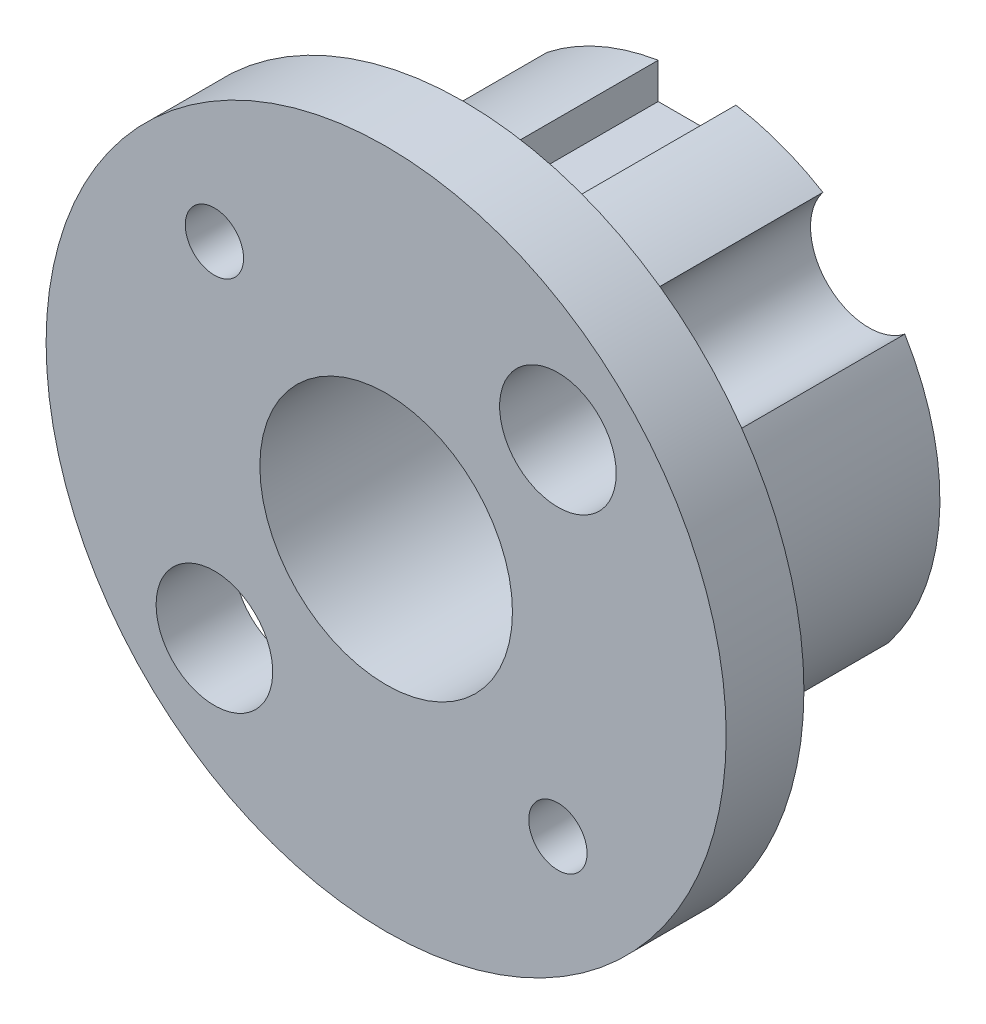
ISO-10303-21;
HEADER;
FILE_DESCRIPTION(('STEP AP214'),'2;1');
FILE_NAME('part.step','',(''),(''),'','','');
FILE_SCHEMA(('AUTOMOTIVE_DESIGN { 1 0 10303 214 1 1 1 1 }'));
ENDSEC;
DATA;
#1=APPLICATION_CONTEXT('core data for automotive mechanical design processes');
#2=APPLICATION_PROTOCOL_DEFINITION('international standard','automotive_design',2000,#1);
#3=PRODUCT_CONTEXT('',#1,'mechanical');
#4=PRODUCT('Part','Part','',(#3));
#5=PRODUCT_RELATED_PRODUCT_CATEGORY('part','',(#4));
#6=PRODUCT_DEFINITION_FORMATION('','',#4);
#7=PRODUCT_DEFINITION_CONTEXT('part definition',#1,'design');
#8=PRODUCT_DEFINITION('design','',#6,#7);
#9=PRODUCT_DEFINITION_SHAPE('','',#8);
#10=(LENGTH_UNIT() NAMED_UNIT(*) SI_UNIT(.MILLI.,.METRE.));
#11=(NAMED_UNIT(*) PLANE_ANGLE_UNIT() SI_UNIT($,.RADIAN.));
#12=(NAMED_UNIT(*) SI_UNIT($,.STERADIAN.) SOLID_ANGLE_UNIT());
#13=UNCERTAINTY_MEASURE_WITH_UNIT(LENGTH_MEASURE(1.E-05),#10,'distance_accuracy_value','');
#14=(GEOMETRIC_REPRESENTATION_CONTEXT(3) GLOBAL_UNCERTAINTY_ASSIGNED_CONTEXT((#13)) GLOBAL_UNIT_ASSIGNED_CONTEXT((#10,
#11,#12)) REPRESENTATION_CONTEXT('',''));
#15=CARTESIAN_POINT('',(0.,0.,0.));
#16=DIRECTION('',(0.,0.,1.));
#17=DIRECTION('',(1.,0.,0.));
#18=AXIS2_PLACEMENT_3D('',#15,#16,#17);
#19=CARTESIAN_POINT('',(0.,0.,12.));
#20=DIRECTION('',(0.,0.,-1.));
#21=DIRECTION('',(-1.,0.,0.));
#22=AXIS2_PLACEMENT_3D('',#19,#20,#21);
#23=CYLINDRICAL_SURFACE('',#22,12.5);
#24=CARTESIAN_POINT('',(0.,0.,0.));
#25=DIRECTION('',(0.,0.,1.));
#26=DIRECTION('',(1.,0.,0.));
#27=AXIS2_PLACEMENT_3D('',#24,#25,#26);
#28=CIRCLE('',#27,12.5);
#29=CARTESIAN_POINT('',(1.99999999999999,-12.3389626792531,0.));
#30=VERTEX_POINT('',#29);
#31=CARTESIAN_POINT('',(7.71644589242379,-9.83394441662632,0.));
#32=VERTEX_POINT('',#31);
#33=EDGE_CURVE('E219',#30,#32,#28,.T.);
#34=ORIENTED_EDGE('',*,*,#33,.T.);
#35=DIRECTION('',(0.,0.,1.));
#36=VECTOR('',#35,1.);
#37=CARTESIAN_POINT('',(7.71644589242379,-9.83394441662632,8.));
#38=LINE('',#37,#36);
#39=CARTESIAN_POINT('',(7.71644589242379,-9.83394441662632,12.));
#40=VERTEX_POINT('',#39);
#41=EDGE_CURVE('E200',#32,#40,#38,.T.);
#42=ORIENTED_EDGE('',*,*,#41,.T.);
#43=CARTESIAN_POINT('',(0.,0.,12.));
#44=DIRECTION('',(0.,0.,1.));
#45=DIRECTION('',(1.,0.,0.));
#46=AXIS2_PLACEMENT_3D('',#43,#44,#45);
#47=CIRCLE('',#46,12.5);
#48=CARTESIAN_POINT('',(0.,-12.5,12.));
#49=VERTEX_POINT('',#48);
#50=EDGE_CURVE('E274',#49,#40,#47,.T.);
#51=ORIENTED_EDGE('',*,*,#50,.F.);
#52=CARTESIAN_POINT('',(0.,-12.5,12.));
#53=CARTESIAN_POINT('',(0.0558905429577532,-12.5000020835964,12.000000042498));
#54=CARTESIAN_POINT('',(0.111753971249328,-12.4996246798577,11.997655704353));
#55=CARTESIAN_POINT('',(0.223074214217851,-12.4981330213372,11.9883059218664));
#56=CARTESIAN_POINT('',(0.278531066577653,-12.4970188357387,11.9813009151575));
#57=CARTESIAN_POINT('',(0.443540911461011,-12.4926105383146,11.9533760060253));
#58=CARTESIAN_POINT('',(0.551977808939556,-12.4882504972334,11.9255459342959));
#59=CARTESIAN_POINT('',(0.762565788228954,-12.4771650841322,11.8522808407173));
#60=CARTESIAN_POINT('',(0.864715194600273,-12.4704390848295,11.8068411497334));
#61=CARTESIAN_POINT('',(1.0599576302829,-12.4553635017494,11.6996720068355));
#62=CARTESIAN_POINT('',(1.15305052325027,-12.4470138935346,11.6379423097307));
#63=CARTESIAN_POINT('',(1.32832296447629,-12.429537039633,11.4993792247033));
#64=CARTESIAN_POINT('',(1.41041206904756,-12.420404254393,11.4224321773373));
#65=CARTESIAN_POINT('',(1.56058463585782,-12.402431574554,11.2558468557373));
#66=CARTESIAN_POINT('',(1.62866536080302,-12.3935917374809,11.166206106869));
#67=CARTESIAN_POINT('',(1.74924960717359,-12.3771508989721,10.97615029407));
#68=CARTESIAN_POINT('',(1.80165914935875,-12.3695574900993,10.8756749577867));
#69=CARTESIAN_POINT('',(1.88879493681568,-12.3565531749584,10.6672277160488));
#70=CARTESIAN_POINT('',(1.92353292532613,-12.351140819818,10.5592608432878));
#71=CARTESIAN_POINT('',(1.96587791181031,-12.3444570626391,10.3755525901847));
#72=CARTESIAN_POINT('',(1.97866122475133,-12.3424077338064,10.3009915247811));
#73=CARTESIAN_POINT('',(1.9957236597849,-12.3396558937214,10.1509650813836));
#74=CARTESIAN_POINT('',(2.00001247582687,-12.3389518472605,10.0755008332068));
#75=CARTESIAN_POINT('',(1.99999999999999,-12.3389626792531,10.));
#76=B_SPLINE_CURVE_WITH_KNOTS('',3,(#52,#53,#54,#55,#56,#57,#58,#59,#60,#61,#62,#63,#64,#65,#66,
#67,#68,#69,#70,#71,#72,#73,#74,#75),.UNSPECIFIED.,.F.,.F.,(4,2,2,2,2,2,2,2,2,2,2,4),(0.,
0.167567545990328,0.335119359759175,0.669498567970095,1.00396649649472,1.33843945958565,
1.67551200041385,2.01265034415503,2.35177170840806,2.6906674217365,2.91723347514518,
3.14354082126525),.UNSPECIFIED.);
#77=CARTESIAN_POINT('',(1.99999999999999,-12.3389626792531,10.));
#78=VERTEX_POINT('',#77);
#79=EDGE_CURVE('E437',#49,#78,#76,.T.);
#80=ORIENTED_EDGE('',*,*,#79,.T.);
#81=DIRECTION('',(0.,0.,-1.));
#82=VECTOR('',#81,1.);
#83=CARTESIAN_POINT('',(1.99999999999999,-12.3389626792531,12.));
#84=LINE('',#83,#82);
#85=EDGE_CURVE('E226',#78,#30,#84,.T.);
#86=ORIENTED_EDGE('',*,*,#85,.T.);
#87=EDGE_LOOP('',(#34,#42,#51,#80,#86));
#88=FACE_BOUND('',#87,.T.);
#89=ADVANCED_FACE('F38',(#88),#23,.T.);
#90=CARTESIAN_POINT('',(-9.83394441662635,7.71644589242376,0.));
#91=VERTEX_POINT('',#90);
#92=CARTESIAN_POINT('',(-10.6902677765788,-6.4782848706306,0.));
#93=VERTEX_POINT('',#92);
#94=EDGE_CURVE('E245',#91,#93,#28,.T.);
#95=ORIENTED_EDGE('',*,*,#94,.T.);
#96=DIRECTION('',(0.,0.,1.));
#97=VECTOR('',#96,1.);
#98=CARTESIAN_POINT('',(-10.6902677765788,-6.4782848706306,8.));
#99=LINE('',#98,#97);
#100=CARTESIAN_POINT('',(-10.6902677765788,-6.4782848706306,12.));
#101=VERTEX_POINT('',#100);
#102=EDGE_CURVE('E302',#93,#101,#99,.T.);
#103=ORIENTED_EDGE('',*,*,#102,.T.);
#104=CARTESIAN_POINT('',(-9.83394441662635,7.71644589242376,12.));
#105=VERTEX_POINT('',#104);
#106=EDGE_CURVE('E236',#105,#101,#47,.T.);
#107=ORIENTED_EDGE('',*,*,#106,.F.);
#108=DIRECTION('',(0.,0.,1.));
#109=VECTOR('',#108,1.);
#110=CARTESIAN_POINT('',(-9.83394441662635,7.71644589242376,8.));
#111=LINE('',#110,#109);
#112=EDGE_CURVE('E301',#105,#91,#111,.F.);
#113=ORIENTED_EDGE('',*,*,#112,.T.);
#114=EDGE_LOOP('',(#95,#103,#107,#113));
#115=FACE_BOUND('',#114,.T.);
#116=ADVANCED_FACE('F300',(#115),#23,.T.);
#117=CARTESIAN_POINT('',(-2.,12.3389626792531,0.));
#118=VERTEX_POINT('',#117);
#119=CARTESIAN_POINT('',(-7.7164458924238,9.83394441662632,0.));
#120=VERTEX_POINT('',#119);
#121=EDGE_CURVE('E231',#118,#120,#28,.T.);
#122=ORIENTED_EDGE('',*,*,#121,.T.);
#123=DIRECTION('',(0.,0.,1.));
#124=VECTOR('',#123,1.);
#125=CARTESIAN_POINT('',(-7.7164458924238,9.83394441662632,8.));
#126=LINE('',#125,#124);
#127=CARTESIAN_POINT('',(-7.7164458924238,9.83394441662632,12.));
#128=VERTEX_POINT('',#127);
#129=EDGE_CURVE('E323',#120,#128,#126,.T.);
#130=ORIENTED_EDGE('',*,*,#129,.T.);
#131=CARTESIAN_POINT('',(0.,12.5,12.));
#132=VERTEX_POINT('',#131);
#133=EDGE_CURVE('E277',#132,#128,#47,.T.);
#134=ORIENTED_EDGE('',*,*,#133,.F.);
#135=CARTESIAN_POINT('',(0.,12.5,12.));
#136=CARTESIAN_POINT('',(-0.0558905429577552,12.5000020835964,12.000000042498));
#137=CARTESIAN_POINT('',(-0.11175397124933,12.4996246798577,11.997655704353));
#138=CARTESIAN_POINT('',(-0.223074214217853,12.4981330213372,11.9883059218664));
#139=CARTESIAN_POINT('',(-0.278531066577655,12.4970188357387,11.9813009151575));
#140=CARTESIAN_POINT('',(-0.443540911461013,12.4926105383146,11.9533760060253));
#141=CARTESIAN_POINT('',(-0.551977808939557,12.4882504972334,11.9255459342959));
#142=CARTESIAN_POINT('',(-0.762565788228955,12.4771650841322,11.8522808407173));
#143=CARTESIAN_POINT('',(-0.864715194600275,12.4704390848295,11.8068411497334));
#144=CARTESIAN_POINT('',(-1.0599576302829,12.4553635017494,11.6996720068355));
#145=CARTESIAN_POINT('',(-1.15305052325027,12.4470138935346,11.6379423097307));
#146=CARTESIAN_POINT('',(-1.32832296447629,12.429537039633,11.4993792247033));
#147=CARTESIAN_POINT('',(-1.41041206904756,12.420404254393,11.4224321773373));
#148=CARTESIAN_POINT('',(-1.56058463585782,12.402431574554,11.2558468557373));
#149=CARTESIAN_POINT('',(-1.62866536080302,12.3935917374809,11.166206106869));
#150=CARTESIAN_POINT('',(-1.74924960717359,12.3771508989721,10.97615029407));
#151=CARTESIAN_POINT('',(-1.80165914935875,12.3695574900993,10.8756749577867));
#152=CARTESIAN_POINT('',(-1.88879493681568,12.3565531749584,10.6672277160488));
#153=CARTESIAN_POINT('',(-1.92353292532613,12.351140819818,10.5592608432878));
#154=CARTESIAN_POINT('',(-1.96587791181031,12.3444570626391,10.3755525901847));
#155=CARTESIAN_POINT('',(-1.97866122475133,12.3424077338064,10.3009915247811));
#156=CARTESIAN_POINT('',(-1.9957236597849,12.3396558937214,10.1509650813836));
#157=CARTESIAN_POINT('',(-2.00001247582687,12.3389518472605,10.0755008332068));
#158=CARTESIAN_POINT('',(-2.,12.3389626792531,10.));
#159=B_SPLINE_CURVE_WITH_KNOTS('',3,(#135,#136,#137,#138,#139,#140,#141,#142,#143,#144,#145,
#146,#147,#148,#149,#150,#151,#152,#153,#154,#155,#156,#157,#158),.UNSPECIFIED.,.F.,.F.,(4,2,2,
2,2,2,2,2,2,2,2,4),(0.,0.167567545990328,0.335119359759174,0.669498567970095,1.00396649649472,
1.33843945958565,1.67551200041385,2.01265034415503,2.35177170840805,2.6906674217365,
2.91723347514518,3.14354082126525),.UNSPECIFIED.);
#160=CARTESIAN_POINT('',(-2.,12.3389626792531,10.));
#161=VERTEX_POINT('',#160);
#162=EDGE_CURVE('E11',#132,#161,#159,.T.);
#163=ORIENTED_EDGE('',*,*,#162,.T.);
#164=DIRECTION('',(0.,0.,-1.));
#165=VECTOR('',#164,1.);
#166=CARTESIAN_POINT('',(-2.,12.3389626792531,12.));
#167=LINE('',#166,#165);
#168=EDGE_CURVE('E373',#161,#118,#167,.T.);
#169=ORIENTED_EDGE('',*,*,#168,.T.);
#170=EDGE_LOOP('',(#122,#130,#134,#163,#169));
#171=FACE_BOUND('',#170,.T.);
#172=ADVANCED_FACE('F485',(#171),#23,.T.);
#173=CARTESIAN_POINT('',(9.83394441662635,-7.71644589242376,12.));
#174=VERTEX_POINT('',#173);
#175=CARTESIAN_POINT('',(10.6902677765788,6.4782848706306,12.));
#176=VERTEX_POINT('',#175);
#177=EDGE_CURVE('E238',#174,#176,#47,.T.);
#178=ORIENTED_EDGE('',*,*,#177,.F.);
#179=DIRECTION('',(0.,0.,1.));
#180=VECTOR('',#179,1.);
#181=CARTESIAN_POINT('',(9.83394441662635,-7.71644589242376,8.));
#182=LINE('',#181,#180);
#183=CARTESIAN_POINT('',(9.83394441662635,-7.71644589242376,0.));
#184=VERTEX_POINT('',#183);
#185=EDGE_CURVE('E212',#174,#184,#182,.F.);
#186=ORIENTED_EDGE('',*,*,#185,.T.);
#187=CARTESIAN_POINT('',(10.6902677765788,6.4782848706306,0.));
#188=VERTEX_POINT('',#187);
#189=EDGE_CURVE('E221',#184,#188,#28,.T.);
#190=ORIENTED_EDGE('',*,*,#189,.T.);
#191=DIRECTION('',(0.,0.,1.));
#192=VECTOR('',#191,1.);
#193=CARTESIAN_POINT('',(10.6902677765788,6.4782848706306,8.));
#194=LINE('',#193,#192);
#195=EDGE_CURVE('E340',#188,#176,#194,.T.);
#196=ORIENTED_EDGE('',*,*,#195,.T.);
#197=EDGE_LOOP('',(#178,#186,#190,#196));
#198=FACE_BOUND('',#197,.T.);
#199=ADVANCED_FACE('F498',(#198),#23,.T.);
#200=CARTESIAN_POINT('',(-6.47828487063055,-10.6902677765788,12.));
#201=VERTEX_POINT('',#200);
#202=EDGE_CURVE('E229',#201,#49,#47,.T.);
#203=ORIENTED_EDGE('',*,*,#202,.F.);
#204=DIRECTION('',(0.,0.,1.));
#205=VECTOR('',#204,1.);
#206=CARTESIAN_POINT('',(-6.47828487063056,-10.6902677765788,8.));
#207=LINE('',#206,#205);
#208=CARTESIAN_POINT('',(-6.47828487063056,-10.6902677765788,0.));
#209=VERTEX_POINT('',#208);
#210=EDGE_CURVE('E306',#201,#209,#207,.F.);
#211=ORIENTED_EDGE('',*,*,#210,.T.);
#212=CARTESIAN_POINT('',(-1.99999999999999,-12.3389626792531,0.));
#213=VERTEX_POINT('',#212);
#214=EDGE_CURVE('E241',#209,#213,#28,.T.);
#215=ORIENTED_EDGE('',*,*,#214,.T.);
#216=DIRECTION('',(0.,0.,-1.));
#217=VECTOR('',#216,1.);
#218=CARTESIAN_POINT('',(-1.99999999999999,-12.3389626792531,12.));
#219=LINE('',#218,#217);
#220=CARTESIAN_POINT('',(-1.99999999999999,-12.3389626792531,10.));
#221=VERTEX_POINT('',#220);
#222=EDGE_CURVE('E259',#213,#221,#219,.F.);
#223=ORIENTED_EDGE('',*,*,#222,.T.);
#224=CARTESIAN_POINT('',(-1.99999999999999,-12.3389626792531,10.));
#225=CARTESIAN_POINT('',(-2.00000005506645,-12.3389604493862,10.0558858991006));
#226=CARTESIAN_POINT('',(-1.9976560947646,-12.3393428423211,10.1117446684925));
#227=CARTESIAN_POINT('',(-1.98830789892238,-12.3408534909263,10.2230553322535));
#228=CARTESIAN_POINT('',(-1.98130411089571,-12.3419816749734,10.2785072651767));
#229=CARTESIAN_POINT('',(-1.95338448111261,-12.3464434827045,10.4435006134786));
#230=CARTESIAN_POINT('',(-1.92556009070672,-12.3508545621137,10.5519255958508));
#231=CARTESIAN_POINT('',(-1.85231153724332,-12.3620506890651,10.7624890925939));
#232=CARTESIAN_POINT('',(-1.80688287534576,-12.3688363433962,10.8646259922825));
#233=CARTESIAN_POINT('',(-1.69973950153268,-12.3840139875357,11.0598478333941));
#234=CARTESIAN_POINT('',(-1.63802444361295,-12.3924060114704,11.1529325824468));
#235=CARTESIAN_POINT('',(-1.4994761629108,-12.4099344029248,11.3282144877859));
#236=CARTESIAN_POINT('',(-1.42252599199839,-12.4190761860561,11.4103186274438));
#237=CARTESIAN_POINT('',(-1.25592824724286,-12.4370273478356,11.5605201241274));
#238=CARTESIAN_POINT('',(-1.16627826390237,-12.4458366630031,11.6286148171568));
#239=CARTESIAN_POINT('',(-0.976214272244022,-12.4621886686874,11.7492138030634));
#240=CARTESIAN_POINT('',(-0.875741602257079,-12.4697238224233,11.8016266494663));
#241=CARTESIAN_POINT('',(-0.667299791484408,-12.4826112053308,11.8887694376935));
#242=CARTESIAN_POINT('',(-0.559335638633808,-12.4879648709531,11.9235110193196));
#243=CARTESIAN_POINT('',(-0.375617480288589,-12.4945727415485,11.9658660760765));
#244=CARTESIAN_POINT('',(-0.301042959463293,-12.4965974895009,11.9786539297587));
#245=CARTESIAN_POINT('',(-0.150990358801892,-12.4993154914097,11.9957222305326));
#246=CARTESIAN_POINT('',(-0.0755134178412784,-12.5000102753353,12.0000124533597));
#247=CARTESIAN_POINT('',(0.,-12.5,12.));
#248=B_SPLINE_CURVE_WITH_KNOTS('',3,(#224,#225,#226,#227,#228,#229,#230,#231,#232,#233,#234,
#235,#236,#237,#238,#239,#240,#241,#242,#243,#244,#245,#246,#247),.UNSPECIFIED.,.F.,.F.,(4,2,2,
2,2,2,2,2,2,2,2,4),(0.,0.167553572692233,0.335091056442252,0.669437461377178,1.00386936624387,
1.33830837668286,1.6754217767851,2.01259922227806,2.35170617625324,2.69058947527825,
2.91719561434318,3.14354091231936),.UNSPECIFIED.);
#249=EDGE_CURVE('E429',#221,#49,#248,.T.);
#250=ORIENTED_EDGE('',*,*,#249,.T.);
#251=EDGE_LOOP('',(#203,#211,#215,#223,#250));
#252=FACE_BOUND('',#251,.T.);
#253=ADVANCED_FACE('F508',(#252),#23,.T.);
#254=CARTESIAN_POINT('',(6.47828487063056,10.6902677765788,12.));
#255=VERTEX_POINT('',#254);
#256=EDGE_CURVE('E281',#255,#132,#47,.T.);
#257=ORIENTED_EDGE('',*,*,#256,.F.);
#258=DIRECTION('',(0.,0.,1.));
#259=VECTOR('',#258,1.);
#260=CARTESIAN_POINT('',(6.47828487063056,10.6902677765788,8.));
#261=LINE('',#260,#259);
#262=CARTESIAN_POINT('',(6.47828487063056,10.6902677765788,0.));
#263=VERTEX_POINT('',#262);
#264=EDGE_CURVE('E336',#255,#263,#261,.F.);
#265=ORIENTED_EDGE('',*,*,#264,.T.);
#266=CARTESIAN_POINT('',(2.,12.3389626792531,0.));
#267=VERTEX_POINT('',#266);
#268=EDGE_CURVE('E240',#263,#267,#28,.T.);
#269=ORIENTED_EDGE('',*,*,#268,.T.);
#270=DIRECTION('',(0.,0.,-1.));
#271=VECTOR('',#270,1.);
#272=CARTESIAN_POINT('',(2.,12.3389626792531,12.));
#273=LINE('',#272,#271);
#274=CARTESIAN_POINT('',(2.,12.3389626792531,10.));
#275=VERTEX_POINT('',#274);
#276=EDGE_CURVE('E368',#267,#275,#273,.F.);
#277=ORIENTED_EDGE('',*,*,#276,.T.);
#278=CARTESIAN_POINT('',(2.,12.3389626792531,10.));
#279=CARTESIAN_POINT('',(2.00000005506646,12.3389604493862,10.0558858991006));
#280=CARTESIAN_POINT('',(1.99765609476461,12.3393428423211,10.1117446684925));
#281=CARTESIAN_POINT('',(1.98830789892238,12.3408534909263,10.2230553322535));
#282=CARTESIAN_POINT('',(1.98130411089571,12.3419816749734,10.2785072651767));
#283=CARTESIAN_POINT('',(1.95338448111261,12.3464434827045,10.4435006134786));
#284=CARTESIAN_POINT('',(1.92556009070672,12.3508545621137,10.5519255958508));
#285=CARTESIAN_POINT('',(1.85231153724333,12.3620506890651,10.7624890925939));
#286=CARTESIAN_POINT('',(1.80688287534576,12.3688363433962,10.8646259922825));
#287=CARTESIAN_POINT('',(1.69973950153268,12.3840139875357,11.0598478333941));
#288=CARTESIAN_POINT('',(1.63802444361296,12.3924060114704,11.1529325824468));
#289=CARTESIAN_POINT('',(1.4994761629108,12.4099344029248,11.3282144877859));
#290=CARTESIAN_POINT('',(1.4225259919984,12.4190761860561,11.4103186274438));
#291=CARTESIAN_POINT('',(1.25592824724286,12.4370273478356,11.5605201241274));
#292=CARTESIAN_POINT('',(1.16627826390238,12.4458366630031,11.6286148171568));
#293=CARTESIAN_POINT('',(0.976214272244024,12.4621886686874,11.7492138030634));
#294=CARTESIAN_POINT('',(0.875741602257082,12.4697238224233,11.8016266494663));
#295=CARTESIAN_POINT('',(0.667299791484412,12.4826112053308,11.8887694376935));
#296=CARTESIAN_POINT('',(0.559335638633812,12.4879648709531,11.9235110193196));
#297=CARTESIAN_POINT('',(0.375617480288593,12.4945727415485,11.9658660760765));
#298=CARTESIAN_POINT('',(0.301042959463297,12.4965974895009,11.9786539297587));
#299=CARTESIAN_POINT('',(0.150990358801896,12.4993154914097,11.9957222305326));
#300=CARTESIAN_POINT('',(0.0755134178412821,12.5000102753353,12.0000124533597));
#301=CARTESIAN_POINT('',(0.,12.5,12.));
#302=B_SPLINE_CURVE_WITH_KNOTS('',3,(#278,#279,#280,#281,#282,#283,#284,#285,#286,#287,#288,
#289,#290,#291,#292,#293,#294,#295,#296,#297,#298,#299,#300,#301),.UNSPECIFIED.,.F.,.F.,(4,2,2,
2,2,2,2,2,2,2,2,4),(0.,0.167553572692233,0.335091056442252,0.669437461377178,1.00386936624387,
1.33830837668286,1.6754217767851,2.01259922227806,2.35170617625324,2.69058947527825,
2.91719561434318,3.14354091231936),.UNSPECIFIED.);
#303=EDGE_CURVE('E49',#275,#132,#302,.T.);
#304=ORIENTED_EDGE('',*,*,#303,.T.);
#305=EDGE_LOOP('',(#257,#265,#269,#277,#304));
#306=FACE_BOUND('',#305,.T.);
#307=ADVANCED_FACE('F443',(#306),#23,.T.);
#308=CARTESIAN_POINT('',(0.,0.,0.));
#309=DIRECTION('',(0.,0.,1.));
#310=DIRECTION('',(1.,0.,0.));
#311=AXIS2_PLACEMENT_3D('',#308,#309,#310);
#312=PLANE('',#311);
#313=CARTESIAN_POINT('',(0.,0.,0.));
#314=DIRECTION('',(0.,0.,1.));
#315=DIRECTION('',(1.,0.,0.));
#316=AXIS2_PLACEMENT_3D('',#313,#314,#315);
#317=CIRCLE('',#316,6.5);
#318=CARTESIAN_POINT('',(6.5,0.,0.));
#319=VERTEX_POINT('',#318);
#320=EDGE_CURVE('E349',#319,#319,#317,.T.);
#321=ORIENTED_EDGE('',*,*,#320,.T.);
#322=EDGE_LOOP('',(#321));
#323=FACE_BOUND('',#322,.T.);
#324=ORIENTED_EDGE('',*,*,#189,.F.);
#325=CARTESIAN_POINT('',(8.83883476483186,-8.83883476483183,0.));
#326=DIRECTION('',(0.,0.,1.));
#327=DIRECTION('',(-1.,0.,0.));
#328=AXIS2_PLACEMENT_3D('',#325,#326,#327);
#329=CIRCLE('',#328,1.5);
#330=EDGE_CURVE('E203',#184,#32,#329,.T.);
#331=ORIENTED_EDGE('',*,*,#330,.T.);
#332=ORIENTED_EDGE('',*,*,#33,.F.);
#333=DIRECTION('',(0.,1.,0.));
#334=VECTOR('',#333,1.);
#335=CARTESIAN_POINT('',(2.00000000000001,0.,0.));
#336=LINE('',#335,#334);
#337=CARTESIAN_POINT('',(2.,-10.5,0.));
#338=VERTEX_POINT('',#337);
#339=EDGE_CURVE('E276',#30,#338,#336,.T.);
#340=ORIENTED_EDGE('',*,*,#339,.T.);
#341=DIRECTION('',(-1.,0.,0.));
#342=VECTOR('',#341,1.);
#343=CARTESIAN_POINT('',(-2.,-10.5,0.));
#344=LINE('',#343,#342);
#345=CARTESIAN_POINT('',(-2.,-10.5,0.));
#346=VERTEX_POINT('',#345);
#347=EDGE_CURVE('E380',#338,#346,#344,.T.);
#348=ORIENTED_EDGE('',*,*,#347,.T.);
#349=DIRECTION('',(0.,-1.,0.));
#350=VECTOR('',#349,1.);
#351=CARTESIAN_POINT('',(-1.99999999999999,-14.2696789134222,0.));
#352=LINE('',#351,#350);
#353=EDGE_CURVE('E376',#346,#213,#352,.T.);
#354=ORIENTED_EDGE('',*,*,#353,.T.);
#355=ORIENTED_EDGE('',*,*,#214,.F.);
#356=CARTESIAN_POINT('',(-8.83883476483183,-8.83883476483186,0.));
#357=DIRECTION('',(0.,0.,1.));
#358=DIRECTION('',(-1.,0.,0.));
#359=AXIS2_PLACEMENT_3D('',#356,#357,#358);
#360=CIRCLE('',#359,3.);
#361=EDGE_CURVE('E503',#209,#93,#360,.T.);
#362=ORIENTED_EDGE('',*,*,#361,.T.);
#363=ORIENTED_EDGE('',*,*,#94,.F.);
#364=CARTESIAN_POINT('',(-8.83883476483186,8.83883476483183,0.));
#365=DIRECTION('',(0.,0.,1.));
#366=DIRECTION('',(1.,0.,0.));
#367=AXIS2_PLACEMENT_3D('',#364,#365,#366);
#368=CIRCLE('',#367,1.5);
#369=EDGE_CURVE('E310',#91,#120,#368,.T.);
#370=ORIENTED_EDGE('',*,*,#369,.T.);
#371=ORIENTED_EDGE('',*,*,#121,.F.);
#372=DIRECTION('',(0.,-1.,0.));
#373=VECTOR('',#372,1.);
#374=CARTESIAN_POINT('',(-1.99999999999999,0.,0.));
#375=LINE('',#374,#373);
#376=CARTESIAN_POINT('',(-2.,10.5,0.));
#377=VERTEX_POINT('',#376);
#378=EDGE_CURVE('E280',#118,#377,#375,.T.);
#379=ORIENTED_EDGE('',*,*,#378,.T.);
#380=DIRECTION('',(1.,0.,0.));
#381=VECTOR('',#380,1.);
#382=CARTESIAN_POINT('',(-2.,10.5,0.));
#383=LINE('',#382,#381);
#384=CARTESIAN_POINT('',(2.,10.5,0.));
#385=VERTEX_POINT('',#384);
#386=EDGE_CURVE('E355',#377,#385,#383,.T.);
#387=ORIENTED_EDGE('',*,*,#386,.T.);
#388=DIRECTION('',(0.,1.,0.));
#389=VECTOR('',#388,1.);
#390=CARTESIAN_POINT('',(2.,14.5,0.));
#391=LINE('',#390,#389);
#392=EDGE_CURVE('E359',#385,#267,#391,.T.);
#393=ORIENTED_EDGE('',*,*,#392,.T.);
#394=ORIENTED_EDGE('',*,*,#268,.F.);
#395=CARTESIAN_POINT('',(8.83883476483183,8.83883476483186,0.));
#396=DIRECTION('',(0.,0.,1.));
#397=DIRECTION('',(1.,0.,0.));
#398=AXIS2_PLACEMENT_3D('',#395,#396,#397);
#399=CIRCLE('',#398,3.);
#400=EDGE_CURVE('E326',#263,#188,#399,.T.);
#401=ORIENTED_EDGE('',*,*,#400,.T.);
#402=EDGE_LOOP('',(#324,#331,#332,#340,#348,#354,#355,#362,#363,#370,#371,#379,#387,#393,#394,#401));
#403=FACE_BOUND('',#402,.T.);
#404=ADVANCED_FACE('F217',(#323,#403),#312,.F.);
#405=CARTESIAN_POINT('',(-1.99999999999999,-14.2696789134222,0.));
#406=DIRECTION('',(-1.,0.,0.));
#407=DIRECTION('',(0.,-1.,0.));
#408=AXIS2_PLACEMENT_3D('',#405,#406,#407);
#409=PLANE('',#408);
#410=DIRECTION('',(0.,0.,1.));
#411=VECTOR('',#410,1.);
#412=CARTESIAN_POINT('',(-2.,-10.5,0.));
#413=LINE('',#412,#411);
#414=CARTESIAN_POINT('',(-2.,-10.5,10.));
#415=VERTEX_POINT('',#414);
#416=EDGE_CURVE('E271',#346,#415,#413,.T.);
#417=ORIENTED_EDGE('',*,*,#416,.T.);
#418=DIRECTION('',(0.,-1.,0.));
#419=VECTOR('',#418,1.);
#420=CARTESIAN_POINT('',(-1.99999999999999,-14.2696789134222,10.));
#421=LINE('',#420,#419);
#422=EDGE_CURVE('E406',#415,#221,#421,.T.);
#423=ORIENTED_EDGE('',*,*,#422,.T.);
#424=ORIENTED_EDGE('',*,*,#222,.F.);
#425=ORIENTED_EDGE('',*,*,#353,.F.);
#426=EDGE_LOOP('',(#417,#423,#424,#425));
#427=FACE_BOUND('',#426,.T.);
#428=ADVANCED_FACE('F511',(#427),#409,.F.);
#429=CARTESIAN_POINT('',(1.99999999999999,-14.2696789134222,0.));
#430=DIRECTION('',(1.,0.,0.));
#431=DIRECTION('',(0.,1.,0.));
#432=AXIS2_PLACEMENT_3D('',#429,#430,#431);
#433=PLANE('',#432);
#434=ORIENTED_EDGE('',*,*,#85,.F.);
#435=DIRECTION('',(0.,1.,0.));
#436=VECTOR('',#435,1.);
#437=CARTESIAN_POINT('',(1.99999999999999,-14.2696789134222,10.));
#438=LINE('',#437,#436);
#439=CARTESIAN_POINT('',(2.,-10.5,10.));
#440=VERTEX_POINT('',#439);
#441=EDGE_CURVE('E400',#78,#440,#438,.T.);
#442=ORIENTED_EDGE('',*,*,#441,.T.);
#443=DIRECTION('',(0.,0.,1.));
#444=VECTOR('',#443,1.);
#445=CARTESIAN_POINT('',(2.,-10.5,0.));
#446=LINE('',#445,#444);
#447=EDGE_CURVE('E384',#338,#440,#446,.T.);
#448=ORIENTED_EDGE('',*,*,#447,.F.);
#449=ORIENTED_EDGE('',*,*,#339,.F.);
#450=EDGE_LOOP('',(#434,#442,#448,#449));
#451=FACE_BOUND('',#450,.T.);
#452=ADVANCED_FACE('F513',(#451),#433,.F.);
#453=CARTESIAN_POINT('',(-2.,-10.5,0.));
#454=DIRECTION('',(0.,1.,0.));
#455=DIRECTION('',(0.,0.,1.));
#456=AXIS2_PLACEMENT_3D('',#453,#454,#455);
#457=PLANE('',#456);
#458=CARTESIAN_POINT('',(0.,-10.5,10.));
#459=DIRECTION('',(0.,1.,0.));
#460=DIRECTION('',(0.,0.,1.));
#461=AXIS2_PLACEMENT_3D('',#458,#459,#460);
#462=CIRCLE('',#461,2.);
#463=CARTESIAN_POINT('',(0.,-10.5,12.));
#464=VERTEX_POINT('',#463);
#465=EDGE_CURVE('E393',#440,#464,#462,.F.);
#466=ORIENTED_EDGE('',*,*,#465,.T.);
#467=CARTESIAN_POINT('',(0.,-10.5,10.));
#468=DIRECTION('',(0.,1.,0.));
#469=DIRECTION('',(0.,0.,1.));
#470=AXIS2_PLACEMENT_3D('',#467,#468,#469);
#471=CIRCLE('',#470,2.);
#472=EDGE_CURVE('E405',#464,#415,#471,.F.);
#473=ORIENTED_EDGE('',*,*,#472,.T.);
#474=ORIENTED_EDGE('',*,*,#416,.F.);
#475=ORIENTED_EDGE('',*,*,#347,.F.);
#476=ORIENTED_EDGE('',*,*,#447,.T.);
#477=EDGE_LOOP('',(#466,#473,#474,#475,#476));
#478=FACE_BOUND('',#477,.T.);
#479=ADVANCED_FACE('F392',(#478),#457,.F.);
#480=CARTESIAN_POINT('',(-2.,14.5,0.));
#481=DIRECTION('',(-1.,0.,0.));
#482=DIRECTION('',(0.,-1.,0.));
#483=AXIS2_PLACEMENT_3D('',#480,#481,#482);
#484=PLANE('',#483);
#485=ORIENTED_EDGE('',*,*,#168,.F.);
#486=DIRECTION('',(0.,-1.,0.));
#487=VECTOR('',#486,1.);
#488=CARTESIAN_POINT('',(-2.,14.5,10.));
#489=LINE('',#488,#487);
#490=CARTESIAN_POINT('',(-2.,10.5,10.));
#491=VERTEX_POINT('',#490);
#492=EDGE_CURVE('E68',#161,#491,#489,.T.);
#493=ORIENTED_EDGE('',*,*,#492,.T.);
#494=DIRECTION('',(0.,0.,1.));
#495=VECTOR('',#494,1.);
#496=CARTESIAN_POINT('',(-2.,10.5,0.));
#497=LINE('',#496,#495);
#498=EDGE_CURVE('E363',#377,#491,#497,.T.);
#499=ORIENTED_EDGE('',*,*,#498,.F.);
#500=ORIENTED_EDGE('',*,*,#378,.F.);
#501=EDGE_LOOP('',(#485,#493,#499,#500));
#502=FACE_BOUND('',#501,.T.);
#503=ADVANCED_FACE('F482',(#502),#484,.F.);
#504=CARTESIAN_POINT('',(2.,14.5,0.));
#505=DIRECTION('',(1.,0.,0.));
#506=DIRECTION('',(0.,1.,0.));
#507=AXIS2_PLACEMENT_3D('',#504,#505,#506);
#508=PLANE('',#507);
#509=DIRECTION('',(0.,0.,1.));
#510=VECTOR('',#509,1.);
#511=CARTESIAN_POINT('',(2.,10.5,0.));
#512=LINE('',#511,#510);
#513=CARTESIAN_POINT('',(2.,10.5,10.));
#514=VERTEX_POINT('',#513);
#515=EDGE_CURVE('E364',#385,#514,#512,.T.);
#516=ORIENTED_EDGE('',*,*,#515,.T.);
#517=DIRECTION('',(0.,1.,0.));
#518=VECTOR('',#517,1.);
#519=CARTESIAN_POINT('',(2.,14.5,10.));
#520=LINE('',#519,#518);
#521=EDGE_CURVE('E417',#514,#275,#520,.T.);
#522=ORIENTED_EDGE('',*,*,#521,.T.);
#523=ORIENTED_EDGE('',*,*,#276,.F.);
#524=ORIENTED_EDGE('',*,*,#392,.F.);
#525=EDGE_LOOP('',(#516,#522,#523,#524));
#526=FACE_BOUND('',#525,.T.);
#527=ADVANCED_FACE('F492',(#526),#508,.F.);
#528=CARTESIAN_POINT('',(-2.,10.5,0.));
#529=DIRECTION('',(0.,-1.,0.));
#530=DIRECTION('',(0.,0.,-1.));
#531=AXIS2_PLACEMENT_3D('',#528,#529,#530);
#532=PLANE('',#531);
#533=CARTESIAN_POINT('',(0.,10.5,10.));
#534=DIRECTION('',(0.,-1.,0.));
#535=DIRECTION('',(0.,0.,-1.));
#536=AXIS2_PLACEMENT_3D('',#533,#534,#535);
#537=CIRCLE('',#536,2.);
#538=CARTESIAN_POINT('',(0.,10.5,12.));
#539=VERTEX_POINT('',#538);
#540=EDGE_CURVE('E421',#491,#539,#537,.F.);
#541=ORIENTED_EDGE('',*,*,#540,.T.);
#542=CARTESIAN_POINT('',(0.,10.5,10.));
#543=DIRECTION('',(0.,-1.,0.));
#544=DIRECTION('',(0.,0.,-1.));
#545=AXIS2_PLACEMENT_3D('',#542,#543,#544);
#546=CIRCLE('',#545,2.);
#547=EDGE_CURVE('E424',#539,#514,#546,.F.);
#548=ORIENTED_EDGE('',*,*,#547,.T.);
#549=ORIENTED_EDGE('',*,*,#515,.F.);
#550=ORIENTED_EDGE('',*,*,#386,.F.);
#551=ORIENTED_EDGE('',*,*,#498,.T.);
#552=EDGE_LOOP('',(#541,#548,#549,#550,#551));
#553=FACE_BOUND('',#552,.T.);
#554=ADVANCED_FACE('F477',(#553),#532,.F.);
#555=CARTESIAN_POINT('',(0.,0.,0.));
#556=DIRECTION('',(0.,0.,1.));
#557=DIRECTION('',(1.,0.,0.));
#558=AXIS2_PLACEMENT_3D('',#555,#556,#557);
#559=CYLINDRICAL_SURFACE('',#558,6.5);
#560=ORIENTED_EDGE('',*,*,#320,.F.);
#561=EDGE_LOOP('',(#560));
#562=FACE_BOUND('',#561,.T.);
#563=CARTESIAN_POINT('',(0.,0.,16.));
#564=DIRECTION('',(0.,0.,1.));
#565=DIRECTION('',(1.,0.,0.));
#566=AXIS2_PLACEMENT_3D('',#563,#564,#565);
#567=CIRCLE('',#566,6.5);
#568=CARTESIAN_POINT('',(6.5,0.,16.));
#569=VERTEX_POINT('',#568);
#570=EDGE_CURVE('E465',#569,#569,#567,.T.);
#571=ORIENTED_EDGE('',*,*,#570,.T.);
#572=EDGE_LOOP('',(#571));
#573=FACE_BOUND('',#572,.T.);
#574=ADVANCED_FACE('F568',(#562,#573),#559,.F.);
#575=CARTESIAN_POINT('',(0.,0.,12.));
#576=DIRECTION('',(0.,0.,-1.));
#577=DIRECTION('',(-1.,0.,0.));
#578=AXIS2_PLACEMENT_3D('',#575,#576,#577);
#579=PLANE('',#578);
#580=ORIENTED_EDGE('',*,*,#202,.T.);
#581=ORIENTED_EDGE('',*,*,#50,.T.);
#582=CARTESIAN_POINT('',(8.83883476483186,-8.83883476483183,12.));
#583=DIRECTION('',(0.,0.,-1.));
#584=DIRECTION('',(-1.,0.,0.));
#585=AXIS2_PLACEMENT_3D('',#582,#583,#584);
#586=CIRCLE('',#585,1.5);
#587=EDGE_CURVE('E206',#174,#40,#586,.T.);
#588=ORIENTED_EDGE('',*,*,#587,.F.);
#589=ORIENTED_EDGE('',*,*,#177,.T.);
#590=CARTESIAN_POINT('',(8.83883476483183,8.83883476483186,12.));
#591=DIRECTION('',(0.,0.,-1.));
#592=DIRECTION('',(-1.,0.,0.));
#593=AXIS2_PLACEMENT_3D('',#590,#591,#592);
#594=CIRCLE('',#593,3.);
#595=EDGE_CURVE('E329',#255,#176,#594,.T.);
#596=ORIENTED_EDGE('',*,*,#595,.F.);
#597=ORIENTED_EDGE('',*,*,#256,.T.);
#598=ORIENTED_EDGE('',*,*,#133,.T.);
#599=CARTESIAN_POINT('',(-8.83883476483186,8.83883476483183,12.));
#600=DIRECTION('',(0.,0.,-1.));
#601=DIRECTION('',(-1.,0.,0.));
#602=AXIS2_PLACEMENT_3D('',#599,#600,#601);
#603=CIRCLE('',#602,1.5);
#604=EDGE_CURVE('E299',#105,#128,#603,.T.);
#605=ORIENTED_EDGE('',*,*,#604,.F.);
#606=ORIENTED_EDGE('',*,*,#106,.T.);
#607=CARTESIAN_POINT('',(-8.83883476483183,-8.83883476483186,12.));
#608=DIRECTION('',(0.,0.,-1.));
#609=DIRECTION('',(-1.,0.,0.));
#610=AXIS2_PLACEMENT_3D('',#607,#608,#609);
#611=CIRCLE('',#610,3.);
#612=EDGE_CURVE('E297',#201,#101,#611,.T.);
#613=ORIENTED_EDGE('',*,*,#612,.F.);
#614=EDGE_LOOP('',(#580,#581,#588,#589,#596,#597,#598,#605,#606,#613));
#615=FACE_BOUND('',#614,.T.);
#616=CARTESIAN_POINT('',(0.,0.,12.));
#617=DIRECTION('',(0.,0.,-1.));
#618=DIRECTION('',(-1.,0.,0.));
#619=AXIS2_PLACEMENT_3D('',#616,#617,#618);
#620=CIRCLE('',#619,17.5);
#621=CARTESIAN_POINT('',(-17.5,0.,12.));
#622=VERTEX_POINT('',#621);
#623=EDGE_CURVE('E344',#622,#622,#620,.T.);
#624=ORIENTED_EDGE('',*,*,#623,.T.);
#625=EDGE_LOOP('',(#624));
#626=FACE_BOUND('',#625,.T.);
#627=ADVANCED_FACE('F295',(#615,#626),#579,.T.);
#628=CARTESIAN_POINT('',(0.,0.,16.));
#629=DIRECTION('',(0.,0.,-1.));
#630=DIRECTION('',(-1.,0.,0.));
#631=AXIS2_PLACEMENT_3D('',#628,#629,#630);
#632=CYLINDRICAL_SURFACE('',#631,17.5);
#633=CARTESIAN_POINT('',(0.,0.,16.));
#634=DIRECTION('',(0.,0.,-1.));
#635=DIRECTION('',(-1.,0.,0.));
#636=AXIS2_PLACEMENT_3D('',#633,#634,#635);
#637=CIRCLE('',#636,17.5);
#638=CARTESIAN_POINT('',(-17.5,0.,16.));
#639=VERTEX_POINT('',#638);
#640=EDGE_CURVE('E345',#639,#639,#637,.T.);
#641=ORIENTED_EDGE('',*,*,#640,.T.);
#642=EDGE_LOOP('',(#641));
#643=FACE_BOUND('',#642,.T.);
#644=ORIENTED_EDGE('',*,*,#623,.F.);
#645=EDGE_LOOP('',(#644));
#646=FACE_BOUND('',#645,.T.);
#647=ADVANCED_FACE('F550',(#643,#646),#632,.T.);
#648=CARTESIAN_POINT('',(0.,0.,16.));
#649=DIRECTION('',(0.,0.,-1.));
#650=DIRECTION('',(-1.,0.,0.));
#651=AXIS2_PLACEMENT_3D('',#648,#649,#650);
#652=PLANE('',#651);
#653=ORIENTED_EDGE('',*,*,#570,.F.);
#654=EDGE_LOOP('',(#653));
#655=FACE_BOUND('',#654,.T.);
#656=CARTESIAN_POINT('',(8.83883476483186,-8.83883476483183,16.));
#657=DIRECTION('',(0.,0.,1.));
#658=DIRECTION('',(-1.,0.,0.));
#659=AXIS2_PLACEMENT_3D('',#656,#657,#658);
#660=CIRCLE('',#659,1.5);
#661=CARTESIAN_POINT('',(7.33883476483185,-8.83883476483183,16.));
#662=VERTEX_POINT('',#661);
#663=EDGE_CURVE('E223',#662,#662,#660,.T.);
#664=ORIENTED_EDGE('',*,*,#663,.F.);
#665=EDGE_LOOP('',(#664));
#666=FACE_BOUND('',#665,.T.);
#667=CARTESIAN_POINT('',(-8.83883476483183,-8.83883476483186,16.));
#668=DIRECTION('',(0.,0.,1.));
#669=DIRECTION('',(-1.,0.,0.));
#670=AXIS2_PLACEMENT_3D('',#667,#668,#669);
#671=CIRCLE('',#670,3.);
#672=CARTESIAN_POINT('',(-11.8388347648318,-8.83883476483186,16.));
#673=VERTEX_POINT('',#672);
#674=EDGE_CURVE('E211',#673,#673,#671,.T.);
#675=ORIENTED_EDGE('',*,*,#674,.F.);
#676=EDGE_LOOP('',(#675));
#677=FACE_BOUND('',#676,.T.);
#678=CARTESIAN_POINT('',(-8.83883476483186,8.83883476483183,16.));
#679=DIRECTION('',(0.,0.,1.));
#680=DIRECTION('',(1.,0.,0.));
#681=AXIS2_PLACEMENT_3D('',#678,#679,#680);
#682=CIRCLE('',#681,1.5);
#683=CARTESIAN_POINT('',(-7.33883476483186,8.83883476483183,16.));
#684=VERTEX_POINT('',#683);
#685=EDGE_CURVE('E305',#684,#684,#682,.T.);
#686=ORIENTED_EDGE('',*,*,#685,.F.);
#687=EDGE_LOOP('',(#686));
#688=FACE_BOUND('',#687,.T.);
#689=CARTESIAN_POINT('',(8.83883476483183,8.83883476483186,16.));
#690=DIRECTION('',(0.,0.,1.));
#691=DIRECTION('',(1.,0.,0.));
#692=AXIS2_PLACEMENT_3D('',#689,#690,#691);
#693=CIRCLE('',#692,3.);
#694=CARTESIAN_POINT('',(11.8388347648318,8.83883476483186,16.));
#695=VERTEX_POINT('',#694);
#696=EDGE_CURVE('E325',#695,#695,#693,.T.);
#697=ORIENTED_EDGE('',*,*,#696,.F.);
#698=EDGE_LOOP('',(#697));
#699=FACE_BOUND('',#698,.T.);
#700=ORIENTED_EDGE('',*,*,#640,.F.);
#701=EDGE_LOOP('',(#700));
#702=FACE_BOUND('',#701,.T.);
#703=ADVANCED_FACE('F582',(#655,#666,#677,#688,#699,#702),#652,.F.);
#704=CARTESIAN_POINT('',(8.83883476483183,8.83883476483186,0.));
#705=DIRECTION('',(0.,0.,1.));
#706=DIRECTION('',(1.,0.,0.));
#707=AXIS2_PLACEMENT_3D('',#704,#705,#706);
#708=CYLINDRICAL_SURFACE('',#707,3.);
#709=ORIENTED_EDGE('',*,*,#696,.T.);
#710=EDGE_LOOP('',(#709));
#711=FACE_BOUND('',#710,.T.);
#712=ORIENTED_EDGE('',*,*,#400,.F.);
#713=ORIENTED_EDGE('',*,*,#264,.F.);
#714=ORIENTED_EDGE('',*,*,#595,.T.);
#715=ORIENTED_EDGE('',*,*,#195,.F.);
#716=EDGE_LOOP('',(#712,#713,#714,#715));
#717=FACE_BOUND('',#716,.T.);
#718=ADVANCED_FACE('F495',(#711,#717),#708,.F.);
#719=CARTESIAN_POINT('',(-8.83883476483186,8.83883476483183,0.));
#720=DIRECTION('',(0.,0.,1.));
#721=DIRECTION('',(1.,0.,0.));
#722=AXIS2_PLACEMENT_3D('',#719,#720,#721);
#723=CYLINDRICAL_SURFACE('',#722,1.5);
#724=ORIENTED_EDGE('',*,*,#685,.T.);
#725=EDGE_LOOP('',(#724));
#726=FACE_BOUND('',#725,.T.);
#727=ORIENTED_EDGE('',*,*,#369,.F.);
#728=ORIENTED_EDGE('',*,*,#112,.F.);
#729=ORIENTED_EDGE('',*,*,#604,.T.);
#730=ORIENTED_EDGE('',*,*,#129,.F.);
#731=EDGE_LOOP('',(#727,#728,#729,#730));
#732=FACE_BOUND('',#731,.T.);
#733=ADVANCED_FACE('F484',(#726,#732),#723,.F.);
#734=CARTESIAN_POINT('',(-8.83883476483183,-8.83883476483186,0.));
#735=DIRECTION('',(0.,0.,1.));
#736=DIRECTION('',(1.,0.,0.));
#737=AXIS2_PLACEMENT_3D('',#734,#735,#736);
#738=CYLINDRICAL_SURFACE('',#737,3.);
#739=ORIENTED_EDGE('',*,*,#674,.T.);
#740=EDGE_LOOP('',(#739));
#741=FACE_BOUND('',#740,.T.);
#742=ORIENTED_EDGE('',*,*,#361,.F.);
#743=ORIENTED_EDGE('',*,*,#210,.F.);
#744=ORIENTED_EDGE('',*,*,#612,.T.);
#745=ORIENTED_EDGE('',*,*,#102,.F.);
#746=EDGE_LOOP('',(#742,#743,#744,#745));
#747=FACE_BOUND('',#746,.T.);
#748=ADVANCED_FACE('F507',(#741,#747),#738,.F.);
#749=CARTESIAN_POINT('',(8.83883476483186,-8.83883476483183,0.));
#750=DIRECTION('',(0.,0.,1.));
#751=DIRECTION('',(1.,0.,0.));
#752=AXIS2_PLACEMENT_3D('',#749,#750,#751);
#753=CYLINDRICAL_SURFACE('',#752,1.5);
#754=ORIENTED_EDGE('',*,*,#663,.T.);
#755=EDGE_LOOP('',(#754));
#756=FACE_BOUND('',#755,.T.);
#757=ORIENTED_EDGE('',*,*,#330,.F.);
#758=ORIENTED_EDGE('',*,*,#185,.F.);
#759=ORIENTED_EDGE('',*,*,#587,.T.);
#760=ORIENTED_EDGE('',*,*,#41,.F.);
#761=EDGE_LOOP('',(#757,#758,#759,#760));
#762=FACE_BOUND('',#761,.T.);
#763=ADVANCED_FACE('F202',(#756,#762),#753,.F.);
#764=CARTESIAN_POINT('',(0.,-14.2696789134222,10.));
#765=DIRECTION('',(0.,1.,0.));
#766=DIRECTION('',(-1.,0.,0.));
#767=AXIS2_PLACEMENT_3D('',#764,#765,#766);
#768=CYLINDRICAL_SURFACE('',#767,2.);
#769=DIRECTION('',(0.,1.,0.));
#770=VECTOR('',#769,1.);
#771=CARTESIAN_POINT('',(0.,0.,12.));
#772=LINE('',#771,#770);
#773=EDGE_CURVE('E402',#464,#49,#772,.F.);
#774=ORIENTED_EDGE('',*,*,#773,.F.);
#775=ORIENTED_EDGE('',*,*,#465,.F.);
#776=ORIENTED_EDGE('',*,*,#441,.F.);
#777=ORIENTED_EDGE('',*,*,#79,.F.);
#778=EDGE_LOOP('',(#774,#775,#776,#777));
#779=FACE_BOUND('',#778,.T.);
#780=ADVANCED_FACE('F398',(#779),#768,.F.);
#781=CARTESIAN_POINT('',(0.,-14.2696789134222,10.));
#782=DIRECTION('',(0.,-1.,0.));
#783=DIRECTION('',(1.,0.,0.));
#784=AXIS2_PLACEMENT_3D('',#781,#782,#783);
#785=CYLINDRICAL_SURFACE('',#784,2.);
#786=ORIENTED_EDGE('',*,*,#472,.F.);
#787=ORIENTED_EDGE('',*,*,#773,.T.);
#788=ORIENTED_EDGE('',*,*,#249,.F.);
#789=ORIENTED_EDGE('',*,*,#422,.F.);
#790=EDGE_LOOP('',(#786,#787,#788,#789));
#791=FACE_BOUND('',#790,.T.);
#792=ADVANCED_FACE('F446',(#791),#785,.F.);
#793=CARTESIAN_POINT('',(0.,14.5,10.));
#794=DIRECTION('',(0.,-1.,0.));
#795=DIRECTION('',(1.,0.,0.));
#796=AXIS2_PLACEMENT_3D('',#793,#794,#795);
#797=CYLINDRICAL_SURFACE('',#796,2.);
#798=DIRECTION('',(0.,-1.,0.));
#799=VECTOR('',#798,1.);
#800=CARTESIAN_POINT('',(0.,0.,12.));
#801=LINE('',#800,#799);
#802=EDGE_CURVE('E43',#539,#132,#801,.F.);
#803=ORIENTED_EDGE('',*,*,#802,.F.);
#804=ORIENTED_EDGE('',*,*,#540,.F.);
#805=ORIENTED_EDGE('',*,*,#492,.F.);
#806=ORIENTED_EDGE('',*,*,#162,.F.);
#807=EDGE_LOOP('',(#803,#804,#805,#806));
#808=FACE_BOUND('',#807,.T.);
#809=ADVANCED_FACE('F40',(#808),#797,.F.);
#810=CARTESIAN_POINT('',(0.,14.5,10.));
#811=DIRECTION('',(0.,1.,0.));
#812=DIRECTION('',(-1.,0.,0.));
#813=AXIS2_PLACEMENT_3D('',#810,#811,#812);
#814=CYLINDRICAL_SURFACE('',#813,2.);
#815=ORIENTED_EDGE('',*,*,#547,.F.);
#816=ORIENTED_EDGE('',*,*,#802,.T.);
#817=ORIENTED_EDGE('',*,*,#303,.F.);
#818=ORIENTED_EDGE('',*,*,#521,.F.);
#819=EDGE_LOOP('',(#815,#816,#817,#818));
#820=FACE_BOUND('',#819,.T.);
#821=ADVANCED_FACE('F452',(#820),#814,.F.);
#822=CLOSED_SHELL('',(#89,#116,#172,#199,#253,#307,#404,#428,#452,#479,#503,#527,#554,#574,#627,
#647,#703,#718,#733,#748,#763,#780,#792,#809,#821));
#823=MANIFOLD_SOLID_BREP('B2',#822);
#824=ADVANCED_BREP_SHAPE_REPRESENTATION('',(#18,#823),#14);
#825=SHAPE_DEFINITION_REPRESENTATION(#9,#824);
ENDSEC;
END-ISO-10303-21;
